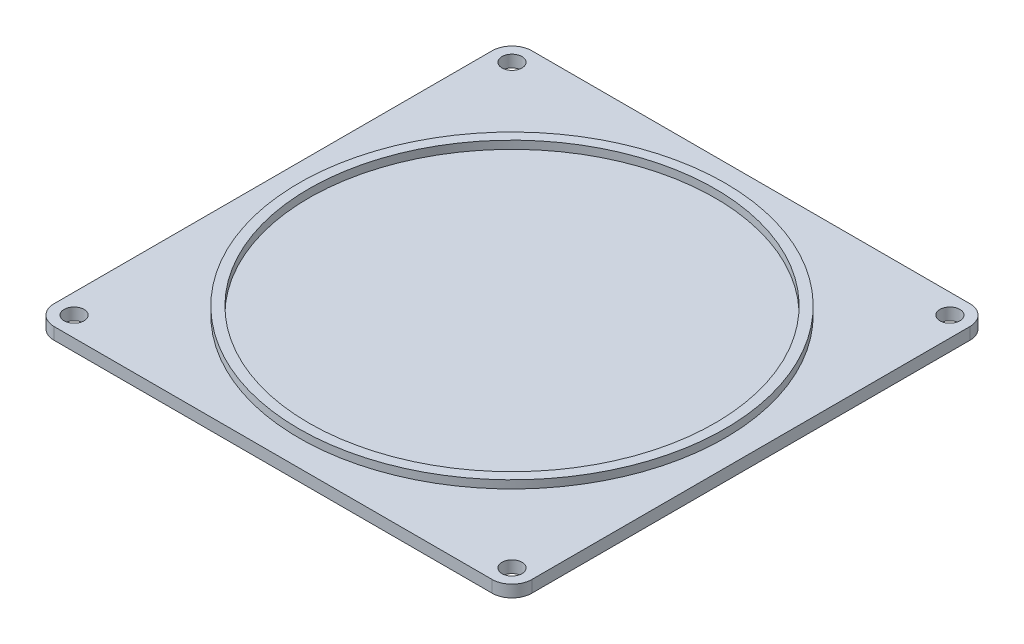
ISO-10303-21;
HEADER;
FILE_DESCRIPTION(('STEP AP214'),'2;1');
FILE_NAME('part.step','',(''),(''),'','','');
FILE_SCHEMA(('AUTOMOTIVE_DESIGN { 1 0 10303 214 1 1 1 1 }'));
ENDSEC;
DATA;
#1=APPLICATION_CONTEXT('core data for automotive mechanical design processes');
#2=APPLICATION_PROTOCOL_DEFINITION('international standard','automotive_design',2000,#1);
#3=PRODUCT_CONTEXT('',#1,'mechanical');
#4=PRODUCT('Part','Part','',(#3));
#5=PRODUCT_RELATED_PRODUCT_CATEGORY('part','',(#4));
#6=PRODUCT_DEFINITION_FORMATION('','',#4);
#7=PRODUCT_DEFINITION_CONTEXT('part definition',#1,'design');
#8=PRODUCT_DEFINITION('design','',#6,#7);
#9=PRODUCT_DEFINITION_SHAPE('','',#8);
#10=(LENGTH_UNIT() NAMED_UNIT(*) SI_UNIT(.MILLI.,.METRE.));
#11=(NAMED_UNIT(*) PLANE_ANGLE_UNIT() SI_UNIT($,.RADIAN.));
#12=(NAMED_UNIT(*) SI_UNIT($,.STERADIAN.) SOLID_ANGLE_UNIT());
#13=UNCERTAINTY_MEASURE_WITH_UNIT(LENGTH_MEASURE(1.E-05),#10,'distance_accuracy_value','');
#14=(GEOMETRIC_REPRESENTATION_CONTEXT(3) GLOBAL_UNCERTAINTY_ASSIGNED_CONTEXT((#13)) GLOBAL_UNIT_ASSIGNED_CONTEXT((#10,
#11,#12)) REPRESENTATION_CONTEXT('',''));
#15=CARTESIAN_POINT('',(0.,0.,0.));
#16=DIRECTION('',(0.,0.,1.));
#17=DIRECTION('',(1.,0.,0.));
#18=AXIS2_PLACEMENT_3D('',#15,#16,#17);
#19=CARTESIAN_POINT('',(60.,3.,60.));
#20=DIRECTION('',(-1.,0.,0.));
#21=DIRECTION('',(0.,0.,1.));
#22=AXIS2_PLACEMENT_3D('',#19,#20,#21);
#23=PLANE('',#22);
#24=DIRECTION('',(0.,0.,-1.));
#25=VECTOR('',#24,1.);
#26=CARTESIAN_POINT('',(60.,0.,60.));
#27=LINE('',#26,#25);
#28=CARTESIAN_POINT('',(60.,0.,55.));
#29=VERTEX_POINT('',#28);
#30=CARTESIAN_POINT('',(60.,0.,-55.));
#31=VERTEX_POINT('',#30);
#32=EDGE_CURVE('E130',#29,#31,#27,.T.);
#33=ORIENTED_EDGE('',*,*,#32,.T.);
#34=DIRECTION('',(0.,-1.,0.));
#35=VECTOR('',#34,1.);
#36=CARTESIAN_POINT('',(60.,3.,-55.));
#37=LINE('',#36,#35);
#38=CARTESIAN_POINT('',(60.,3.,-55.));
#39=VERTEX_POINT('',#38);
#40=EDGE_CURVE('E156',#31,#39,#37,.F.);
#41=ORIENTED_EDGE('',*,*,#40,.T.);
#42=DIRECTION('',(0.,0.,-1.));
#43=VECTOR('',#42,1.);
#44=CARTESIAN_POINT('',(60.,3.,60.));
#45=LINE('',#44,#43);
#46=CARTESIAN_POINT('',(60.,3.,55.));
#47=VERTEX_POINT('',#46);
#48=EDGE_CURVE('E128',#47,#39,#45,.T.);
#49=ORIENTED_EDGE('',*,*,#48,.F.);
#50=DIRECTION('',(0.,-1.,0.));
#51=VECTOR('',#50,1.);
#52=CARTESIAN_POINT('',(60.,3.,55.));
#53=LINE('',#52,#51);
#54=EDGE_CURVE('E153',#47,#29,#53,.T.);
#55=ORIENTED_EDGE('',*,*,#54,.T.);
#56=EDGE_LOOP('',(#33,#41,#49,#55));
#57=FACE_BOUND('',#56,.T.);
#58=ADVANCED_FACE('F35',(#57),#23,.F.);
#59=CARTESIAN_POINT('',(-60.,3.,-60.));
#60=DIRECTION('',(0.,0.,1.));
#61=DIRECTION('',(1.,0.,0.));
#62=AXIS2_PLACEMENT_3D('',#59,#60,#61);
#63=PLANE('',#62);
#64=DIRECTION('',(-1.,0.,0.));
#65=VECTOR('',#64,1.);
#66=CARTESIAN_POINT('',(-60.,0.,-60.));
#67=LINE('',#66,#65);
#68=CARTESIAN_POINT('',(55.,0.,-60.));
#69=VERTEX_POINT('',#68);
#70=CARTESIAN_POINT('',(-55.,0.,-60.));
#71=VERTEX_POINT('',#70);
#72=EDGE_CURVE('E126',#69,#71,#67,.T.);
#73=ORIENTED_EDGE('',*,*,#72,.T.);
#74=DIRECTION('',(0.,-1.,0.));
#75=VECTOR('',#74,1.);
#76=CARTESIAN_POINT('',(-55.,3.,-60.));
#77=LINE('',#76,#75);
#78=CARTESIAN_POINT('',(-55.,3.,-60.));
#79=VERTEX_POINT('',#78);
#80=EDGE_CURVE('E105',#71,#79,#77,.F.);
#81=ORIENTED_EDGE('',*,*,#80,.T.);
#82=DIRECTION('',(-1.,0.,0.));
#83=VECTOR('',#82,1.);
#84=CARTESIAN_POINT('',(-60.,3.,-60.));
#85=LINE('',#84,#83);
#86=CARTESIAN_POINT('',(55.,3.,-60.));
#87=VERTEX_POINT('',#86);
#88=EDGE_CURVE('E172',#87,#79,#85,.T.);
#89=ORIENTED_EDGE('',*,*,#88,.F.);
#90=DIRECTION('',(0.,-1.,0.));
#91=VECTOR('',#90,1.);
#92=CARTESIAN_POINT('',(55.,3.,-60.));
#93=LINE('',#92,#91);
#94=EDGE_CURVE('E110',#87,#69,#93,.T.);
#95=ORIENTED_EDGE('',*,*,#94,.T.);
#96=EDGE_LOOP('',(#73,#81,#89,#95));
#97=FACE_BOUND('',#96,.T.);
#98=ADVANCED_FACE('F239',(#97),#63,.F.);
#99=CARTESIAN_POINT('',(-60.,3.,60.));
#100=DIRECTION('',(1.,0.,0.));
#101=DIRECTION('',(0.,0.,-1.));
#102=AXIS2_PLACEMENT_3D('',#99,#100,#101);
#103=PLANE('',#102);
#104=DIRECTION('',(0.,0.,1.));
#105=VECTOR('',#104,1.);
#106=CARTESIAN_POINT('',(-60.,3.,60.));
#107=LINE('',#106,#105);
#108=CARTESIAN_POINT('',(-60.,3.,-55.));
#109=VERTEX_POINT('',#108);
#110=CARTESIAN_POINT('',(-60.,3.,55.));
#111=VERTEX_POINT('',#110);
#112=EDGE_CURVE('E119',#109,#111,#107,.T.);
#113=ORIENTED_EDGE('',*,*,#112,.F.);
#114=DIRECTION('',(0.,-1.,0.));
#115=VECTOR('',#114,1.);
#116=CARTESIAN_POINT('',(-60.,3.,-55.));
#117=LINE('',#116,#115);
#118=CARTESIAN_POINT('',(-60.,0.,-55.));
#119=VERTEX_POINT('',#118);
#120=EDGE_CURVE('E104',#109,#119,#117,.T.);
#121=ORIENTED_EDGE('',*,*,#120,.T.);
#122=DIRECTION('',(0.,0.,1.));
#123=VECTOR('',#122,1.);
#124=CARTESIAN_POINT('',(-60.,0.,60.));
#125=LINE('',#124,#123);
#126=CARTESIAN_POINT('',(-60.,0.,55.));
#127=VERTEX_POINT('',#126);
#128=EDGE_CURVE('E117',#119,#127,#125,.T.);
#129=ORIENTED_EDGE('',*,*,#128,.T.);
#130=DIRECTION('',(0.,-1.,0.));
#131=VECTOR('',#130,1.);
#132=CARTESIAN_POINT('',(-60.,3.,55.));
#133=LINE('',#132,#131);
#134=EDGE_CURVE('E121',#127,#111,#133,.F.);
#135=ORIENTED_EDGE('',*,*,#134,.T.);
#136=EDGE_LOOP('',(#113,#121,#129,#135));
#137=FACE_BOUND('',#136,.T.);
#138=ADVANCED_FACE('F116',(#137),#103,.F.);
#139=CARTESIAN_POINT('',(-60.,3.,60.));
#140=DIRECTION('',(0.,0.,-1.));
#141=DIRECTION('',(-1.,0.,0.));
#142=AXIS2_PLACEMENT_3D('',#139,#140,#141);
#143=PLANE('',#142);
#144=DIRECTION('',(1.,0.,0.));
#145=VECTOR('',#144,1.);
#146=CARTESIAN_POINT('',(-60.,0.,60.));
#147=LINE('',#146,#145);
#148=CARTESIAN_POINT('',(-55.,0.,60.));
#149=VERTEX_POINT('',#148);
#150=CARTESIAN_POINT('',(55.,0.,60.));
#151=VERTEX_POINT('',#150);
#152=EDGE_CURVE('E125',#149,#151,#147,.T.);
#153=ORIENTED_EDGE('',*,*,#152,.T.);
#154=DIRECTION('',(0.,-1.,0.));
#155=VECTOR('',#154,1.);
#156=CARTESIAN_POINT('',(55.,3.,60.));
#157=LINE('',#156,#155);
#158=CARTESIAN_POINT('',(55.,3.,60.));
#159=VERTEX_POINT('',#158);
#160=EDGE_CURVE('E11',#151,#159,#157,.F.);
#161=ORIENTED_EDGE('',*,*,#160,.T.);
#162=DIRECTION('',(1.,0.,0.));
#163=VECTOR('',#162,1.);
#164=CARTESIAN_POINT('',(-60.,3.,60.));
#165=LINE('',#164,#163);
#166=CARTESIAN_POINT('',(-55.,3.,60.));
#167=VERTEX_POINT('',#166);
#168=EDGE_CURVE('E137',#167,#159,#165,.T.);
#169=ORIENTED_EDGE('',*,*,#168,.F.);
#170=DIRECTION('',(0.,-1.,0.));
#171=VECTOR('',#170,1.);
#172=CARTESIAN_POINT('',(-55.,3.,60.));
#173=LINE('',#172,#171);
#174=EDGE_CURVE('E43',#167,#149,#173,.T.);
#175=ORIENTED_EDGE('',*,*,#174,.T.);
#176=EDGE_LOOP('',(#153,#161,#169,#175));
#177=FACE_BOUND('',#176,.T.);
#178=ADVANCED_FACE('F159',(#177),#143,.F.);
#179=CARTESIAN_POINT('',(0.,3.,0.));
#180=DIRECTION('',(0.,-1.,0.));
#181=DIRECTION('',(0.,0.,-1.));
#182=AXIS2_PLACEMENT_3D('',#179,#180,#181);
#183=PLANE('',#182);
#184=CARTESIAN_POINT('',(55.,3.,-55.));
#185=DIRECTION('',(0.,1.,0.));
#186=DIRECTION('',(0.,0.,-1.));
#187=AXIS2_PLACEMENT_3D('',#184,#185,#186);
#188=CIRCLE('',#187,2.5);
#189=CARTESIAN_POINT('',(55.,3.,-57.5));
#190=VERTEX_POINT('',#189);
#191=EDGE_CURVE('E206',#190,#190,#188,.T.);
#192=ORIENTED_EDGE('',*,*,#191,.F.);
#193=EDGE_LOOP('',(#192));
#194=FACE_BOUND('',#193,.T.);
#195=CARTESIAN_POINT('',(-55.,3.,55.));
#196=DIRECTION('',(0.,1.,0.));
#197=DIRECTION('',(0.,0.,-1.));
#198=AXIS2_PLACEMENT_3D('',#195,#196,#197);
#199=CIRCLE('',#198,2.5);
#200=CARTESIAN_POINT('',(-55.,3.,52.5));
#201=VERTEX_POINT('',#200);
#202=EDGE_CURVE('E199',#201,#201,#199,.T.);
#203=ORIENTED_EDGE('',*,*,#202,.F.);
#204=EDGE_LOOP('',(#203));
#205=FACE_BOUND('',#204,.T.);
#206=CARTESIAN_POINT('',(55.,3.,55.));
#207=DIRECTION('',(0.,1.,0.));
#208=DIRECTION('',(0.,0.,1.));
#209=AXIS2_PLACEMENT_3D('',#206,#207,#208);
#210=CIRCLE('',#209,2.5);
#211=CARTESIAN_POINT('',(55.,3.,57.5));
#212=VERTEX_POINT('',#211);
#213=EDGE_CURVE('E211',#212,#212,#210,.T.);
#214=ORIENTED_EDGE('',*,*,#213,.F.);
#215=EDGE_LOOP('',(#214));
#216=FACE_BOUND('',#215,.T.);
#217=CARTESIAN_POINT('',(-55.,3.,-55.));
#218=DIRECTION('',(0.,1.,0.));
#219=DIRECTION('',(0.,0.,1.));
#220=AXIS2_PLACEMENT_3D('',#217,#218,#219);
#221=CIRCLE('',#220,2.5);
#222=CARTESIAN_POINT('',(-55.,3.,-52.5));
#223=VERTEX_POINT('',#222);
#224=EDGE_CURVE('E193',#223,#223,#221,.T.);
#225=ORIENTED_EDGE('',*,*,#224,.F.);
#226=EDGE_LOOP('',(#225));
#227=FACE_BOUND('',#226,.T.);
#228=CARTESIAN_POINT('',(0.,3.,0.));
#229=DIRECTION('',(0.,-1.,0.));
#230=DIRECTION('',(0.,0.,-1.));
#231=AXIS2_PLACEMENT_3D('',#228,#229,#230);
#232=CIRCLE('',#231,53.5);
#233=CARTESIAN_POINT('',(0.,3.,-53.5));
#234=VERTEX_POINT('',#233);
#235=EDGE_CURVE('E134',#234,#234,#232,.F.);
#236=ORIENTED_EDGE('',*,*,#235,.F.);
#237=EDGE_LOOP('',(#236));
#238=FACE_BOUND('',#237,.T.);
#239=ORIENTED_EDGE('',*,*,#88,.T.);
#240=CARTESIAN_POINT('',(-55.,3.,-55.));
#241=DIRECTION('',(0.,-1.,0.));
#242=DIRECTION('',(0.,0.,-1.));
#243=AXIS2_PLACEMENT_3D('',#240,#241,#242);
#244=CIRCLE('',#243,5.);
#245=EDGE_CURVE('E151',#79,#109,#244,.F.);
#246=ORIENTED_EDGE('',*,*,#245,.T.);
#247=ORIENTED_EDGE('',*,*,#112,.T.);
#248=CARTESIAN_POINT('',(-55.,3.,55.));
#249=DIRECTION('',(0.,-1.,0.));
#250=DIRECTION('',(0.,0.,-1.));
#251=AXIS2_PLACEMENT_3D('',#248,#249,#250);
#252=CIRCLE('',#251,5.);
#253=EDGE_CURVE('E55',#111,#167,#252,.F.);
#254=ORIENTED_EDGE('',*,*,#253,.T.);
#255=ORIENTED_EDGE('',*,*,#168,.T.);
#256=CARTESIAN_POINT('',(55.,3.,55.));
#257=DIRECTION('',(0.,-1.,0.));
#258=DIRECTION('',(0.,0.,-1.));
#259=AXIS2_PLACEMENT_3D('',#256,#257,#258);
#260=CIRCLE('',#259,5.);
#261=EDGE_CURVE('E147',#159,#47,#260,.F.);
#262=ORIENTED_EDGE('',*,*,#261,.T.);
#263=ORIENTED_EDGE('',*,*,#48,.T.);
#264=CARTESIAN_POINT('',(55.,3.,-55.));
#265=DIRECTION('',(0.,-1.,0.));
#266=DIRECTION('',(0.,0.,-1.));
#267=AXIS2_PLACEMENT_3D('',#264,#265,#266);
#268=CIRCLE('',#267,5.);
#269=EDGE_CURVE('E149',#39,#87,#268,.F.);
#270=ORIENTED_EDGE('',*,*,#269,.T.);
#271=EDGE_LOOP('',(#239,#246,#247,#254,#255,#262,#263,#270));
#272=FACE_BOUND('',#271,.T.);
#273=ADVANCED_FACE('F227',(#194,#205,#216,#227,#238,#272),#183,.F.);
#274=CARTESIAN_POINT('',(0.,0.,0.));
#275=DIRECTION('',(0.,-1.,0.));
#276=DIRECTION('',(0.,0.,-1.));
#277=AXIS2_PLACEMENT_3D('',#274,#275,#276);
#278=PLANE('',#277);
#279=CARTESIAN_POINT('',(55.,0.,-55.));
#280=DIRECTION('',(0.,1.,0.));
#281=DIRECTION('',(0.,0.,-1.));
#282=AXIS2_PLACEMENT_3D('',#279,#280,#281);
#283=CIRCLE('',#282,2.5);
#284=CARTESIAN_POINT('',(55.,0.,-57.5));
#285=VERTEX_POINT('',#284);
#286=EDGE_CURVE('E196',#285,#285,#283,.T.);
#287=ORIENTED_EDGE('',*,*,#286,.T.);
#288=EDGE_LOOP('',(#287));
#289=FACE_BOUND('',#288,.T.);
#290=CARTESIAN_POINT('',(-55.,0.,55.));
#291=DIRECTION('',(0.,1.,0.));
#292=DIRECTION('',(0.,0.,-1.));
#293=AXIS2_PLACEMENT_3D('',#290,#291,#292);
#294=CIRCLE('',#293,2.5);
#295=CARTESIAN_POINT('',(-55.,0.,52.5));
#296=VERTEX_POINT('',#295);
#297=EDGE_CURVE('E202',#296,#296,#294,.T.);
#298=ORIENTED_EDGE('',*,*,#297,.T.);
#299=EDGE_LOOP('',(#298));
#300=FACE_BOUND('',#299,.T.);
#301=CARTESIAN_POINT('',(55.,0.,55.));
#302=DIRECTION('',(0.,1.,0.));
#303=DIRECTION('',(0.,0.,1.));
#304=AXIS2_PLACEMENT_3D('',#301,#302,#303);
#305=CIRCLE('',#304,2.5);
#306=CARTESIAN_POINT('',(55.,0.,57.5));
#307=VERTEX_POINT('',#306);
#308=EDGE_CURVE('E203',#307,#307,#305,.T.);
#309=ORIENTED_EDGE('',*,*,#308,.T.);
#310=EDGE_LOOP('',(#309));
#311=FACE_BOUND('',#310,.T.);
#312=CARTESIAN_POINT('',(-55.,0.,-55.));
#313=DIRECTION('',(0.,1.,0.));
#314=DIRECTION('',(0.,0.,1.));
#315=AXIS2_PLACEMENT_3D('',#312,#313,#314);
#316=CIRCLE('',#315,2.5);
#317=CARTESIAN_POINT('',(-55.,0.,-52.5));
#318=VERTEX_POINT('',#317);
#319=EDGE_CURVE('E191',#318,#318,#316,.T.);
#320=ORIENTED_EDGE('',*,*,#319,.T.);
#321=EDGE_LOOP('',(#320));
#322=FACE_BOUND('',#321,.T.);
#323=ORIENTED_EDGE('',*,*,#128,.F.);
#324=CARTESIAN_POINT('',(-55.,0.,-55.));
#325=DIRECTION('',(0.,-1.,0.));
#326=DIRECTION('',(0.,0.,-1.));
#327=AXIS2_PLACEMENT_3D('',#324,#325,#326);
#328=CIRCLE('',#327,5.);
#329=EDGE_CURVE('E100',#119,#71,#328,.T.);
#330=ORIENTED_EDGE('',*,*,#329,.T.);
#331=ORIENTED_EDGE('',*,*,#72,.F.);
#332=CARTESIAN_POINT('',(55.,0.,-55.));
#333=DIRECTION('',(0.,-1.,0.));
#334=DIRECTION('',(0.,0.,-1.));
#335=AXIS2_PLACEMENT_3D('',#332,#333,#334);
#336=CIRCLE('',#335,5.);
#337=EDGE_CURVE('E111',#69,#31,#336,.T.);
#338=ORIENTED_EDGE('',*,*,#337,.T.);
#339=ORIENTED_EDGE('',*,*,#32,.F.);
#340=CARTESIAN_POINT('',(55.,0.,55.));
#341=DIRECTION('',(0.,-1.,0.));
#342=DIRECTION('',(0.,0.,-1.));
#343=AXIS2_PLACEMENT_3D('',#340,#341,#342);
#344=CIRCLE('',#343,5.);
#345=EDGE_CURVE('E140',#29,#151,#344,.T.);
#346=ORIENTED_EDGE('',*,*,#345,.T.);
#347=ORIENTED_EDGE('',*,*,#152,.F.);
#348=CARTESIAN_POINT('',(-55.,0.,55.));
#349=DIRECTION('',(0.,-1.,0.));
#350=DIRECTION('',(0.,0.,-1.));
#351=AXIS2_PLACEMENT_3D('',#348,#349,#350);
#352=CIRCLE('',#351,5.);
#353=EDGE_CURVE('E120',#149,#127,#352,.T.);
#354=ORIENTED_EDGE('',*,*,#353,.T.);
#355=EDGE_LOOP('',(#323,#330,#331,#338,#339,#346,#347,#354));
#356=FACE_BOUND('',#355,.T.);
#357=ADVANCED_FACE('F123',(#289,#300,#311,#322,#356),#278,.T.);
#358=CARTESIAN_POINT('',(0.,5.,0.));
#359=DIRECTION('',(0.,1.,0.));
#360=DIRECTION('',(0.,0.,1.));
#361=AXIS2_PLACEMENT_3D('',#358,#359,#360);
#362=PLANE('',#361);
#363=CARTESIAN_POINT('',(0.,5.,0.));
#364=DIRECTION('',(0.,1.,0.));
#365=DIRECTION('',(0.,0.,1.));
#366=AXIS2_PLACEMENT_3D('',#363,#364,#365);
#367=CIRCLE('',#366,53.5);
#368=CARTESIAN_POINT('',(0.,5.,53.5));
#369=VERTEX_POINT('',#368);
#370=EDGE_CURVE('E177',#369,#369,#367,.T.);
#371=ORIENTED_EDGE('',*,*,#370,.T.);
#372=EDGE_LOOP('',(#371));
#373=FACE_BOUND('',#372,.T.);
#374=CARTESIAN_POINT('',(0.,5.,0.));
#375=DIRECTION('',(0.,1.,0.));
#376=DIRECTION('',(0.,0.,1.));
#377=AXIS2_PLACEMENT_3D('',#374,#375,#376);
#378=CIRCLE('',#377,51.);
#379=CARTESIAN_POINT('',(0.,5.,51.));
#380=VERTEX_POINT('',#379);
#381=EDGE_CURVE('E182',#380,#380,#378,.T.);
#382=ORIENTED_EDGE('',*,*,#381,.F.);
#383=EDGE_LOOP('',(#382));
#384=FACE_BOUND('',#383,.T.);
#385=ADVANCED_FACE('F262',(#373,#384),#362,.T.);
#386=CARTESIAN_POINT('',(0.,5.,0.));
#387=DIRECTION('',(0.,-1.,0.));
#388=DIRECTION('',(0.,0.,-1.));
#389=AXIS2_PLACEMENT_3D('',#386,#387,#388);
#390=CYLINDRICAL_SURFACE('',#389,53.5);
#391=ORIENTED_EDGE('',*,*,#370,.F.);
#392=EDGE_LOOP('',(#391));
#393=FACE_BOUND('',#392,.T.);
#394=ORIENTED_EDGE('',*,*,#235,.T.);
#395=EDGE_LOOP('',(#394));
#396=FACE_BOUND('',#395,.T.);
#397=ADVANCED_FACE('F265',(#393,#396),#390,.T.);
#398=CARTESIAN_POINT('',(0.,5.,0.));
#399=DIRECTION('',(0.,-1.,0.));
#400=DIRECTION('',(0.,0.,-1.));
#401=AXIS2_PLACEMENT_3D('',#398,#399,#400);
#402=CYLINDRICAL_SURFACE('',#401,51.);
#403=ORIENTED_EDGE('',*,*,#381,.T.);
#404=EDGE_LOOP('',(#403));
#405=FACE_BOUND('',#404,.T.);
#406=CARTESIAN_POINT('',(0.,3.,0.));
#407=DIRECTION('',(0.,1.,0.));
#408=DIRECTION('',(0.,0.,1.));
#409=AXIS2_PLACEMENT_3D('',#406,#407,#408);
#410=CIRCLE('',#409,51.);
#411=CARTESIAN_POINT('',(0.,3.,51.));
#412=VERTEX_POINT('',#411);
#413=EDGE_CURVE('E186',#412,#412,#410,.T.);
#414=ORIENTED_EDGE('',*,*,#413,.F.);
#415=EDGE_LOOP('',(#414));
#416=FACE_BOUND('',#415,.T.);
#417=ADVANCED_FACE('F268',(#405,#416),#402,.F.);
#418=ORIENTED_EDGE('',*,*,#413,.T.);
#419=EDGE_LOOP('',(#418));
#420=FACE_BOUND('',#419,.T.);
#421=ADVANCED_FACE('F232',(#420),#183,.F.);
#422=CARTESIAN_POINT('',(-55.,0.,-55.));
#423=DIRECTION('',(0.,1.,0.));
#424=DIRECTION('',(0.,0.,1.));
#425=AXIS2_PLACEMENT_3D('',#422,#423,#424);
#426=CYLINDRICAL_SURFACE('',#425,2.5);
#427=ORIENTED_EDGE('',*,*,#319,.F.);
#428=EDGE_LOOP('',(#427));
#429=FACE_BOUND('',#428,.T.);
#430=ORIENTED_EDGE('',*,*,#224,.T.);
#431=EDGE_LOOP('',(#430));
#432=FACE_BOUND('',#431,.T.);
#433=ADVANCED_FACE('F223',(#429,#432),#426,.F.);
#434=CARTESIAN_POINT('',(55.,0.,55.));
#435=DIRECTION('',(0.,1.,0.));
#436=DIRECTION('',(0.,0.,1.));
#437=AXIS2_PLACEMENT_3D('',#434,#435,#436);
#438=CYLINDRICAL_SURFACE('',#437,2.5);
#439=ORIENTED_EDGE('',*,*,#308,.F.);
#440=EDGE_LOOP('',(#439));
#441=FACE_BOUND('',#440,.T.);
#442=ORIENTED_EDGE('',*,*,#213,.T.);
#443=EDGE_LOOP('',(#442));
#444=FACE_BOUND('',#443,.T.);
#445=ADVANCED_FACE('F219',(#441,#444),#438,.F.);
#446=CARTESIAN_POINT('',(-55.,0.,55.));
#447=DIRECTION('',(0.,1.,0.));
#448=DIRECTION('',(0.,0.,1.));
#449=AXIS2_PLACEMENT_3D('',#446,#447,#448);
#450=CYLINDRICAL_SURFACE('',#449,2.5);
#451=ORIENTED_EDGE('',*,*,#297,.F.);
#452=EDGE_LOOP('',(#451));
#453=FACE_BOUND('',#452,.T.);
#454=ORIENTED_EDGE('',*,*,#202,.T.);
#455=EDGE_LOOP('',(#454));
#456=FACE_BOUND('',#455,.T.);
#457=ADVANCED_FACE('F222',(#453,#456),#450,.F.);
#458=CARTESIAN_POINT('',(55.,0.,-55.));
#459=DIRECTION('',(0.,1.,0.));
#460=DIRECTION('',(0.,0.,1.));
#461=AXIS2_PLACEMENT_3D('',#458,#459,#460);
#462=CYLINDRICAL_SURFACE('',#461,2.5);
#463=ORIENTED_EDGE('',*,*,#286,.F.);
#464=EDGE_LOOP('',(#463));
#465=FACE_BOUND('',#464,.T.);
#466=ORIENTED_EDGE('',*,*,#191,.T.);
#467=EDGE_LOOP('',(#466));
#468=FACE_BOUND('',#467,.T.);
#469=ADVANCED_FACE('F248',(#465,#468),#462,.F.);
#470=CARTESIAN_POINT('',(-55.,3.,-55.));
#471=DIRECTION('',(0.,-1.,0.));
#472=DIRECTION('',(0.,0.,-1.));
#473=AXIS2_PLACEMENT_3D('',#470,#471,#472);
#474=CYLINDRICAL_SURFACE('',#473,5.);
#475=ORIENTED_EDGE('',*,*,#245,.F.);
#476=ORIENTED_EDGE('',*,*,#80,.F.);
#477=ORIENTED_EDGE('',*,*,#329,.F.);
#478=ORIENTED_EDGE('',*,*,#120,.F.);
#479=EDGE_LOOP('',(#475,#476,#477,#478));
#480=FACE_BOUND('',#479,.T.);
#481=ADVANCED_FACE('F103',(#480),#474,.T.);
#482=CARTESIAN_POINT('',(55.,3.,-55.));
#483=DIRECTION('',(0.,-1.,0.));
#484=DIRECTION('',(0.,0.,-1.));
#485=AXIS2_PLACEMENT_3D('',#482,#483,#484);
#486=CYLINDRICAL_SURFACE('',#485,5.);
#487=ORIENTED_EDGE('',*,*,#269,.F.);
#488=ORIENTED_EDGE('',*,*,#40,.F.);
#489=ORIENTED_EDGE('',*,*,#337,.F.);
#490=ORIENTED_EDGE('',*,*,#94,.F.);
#491=EDGE_LOOP('',(#487,#488,#489,#490));
#492=FACE_BOUND('',#491,.T.);
#493=ADVANCED_FACE('F241',(#492),#486,.T.);
#494=CARTESIAN_POINT('',(55.,3.,55.));
#495=DIRECTION('',(0.,-1.,0.));
#496=DIRECTION('',(0.,0.,-1.));
#497=AXIS2_PLACEMENT_3D('',#494,#495,#496);
#498=CYLINDRICAL_SURFACE('',#497,5.);
#499=ORIENTED_EDGE('',*,*,#261,.F.);
#500=ORIENTED_EDGE('',*,*,#160,.F.);
#501=ORIENTED_EDGE('',*,*,#345,.F.);
#502=ORIENTED_EDGE('',*,*,#54,.F.);
#503=EDGE_LOOP('',(#499,#500,#501,#502));
#504=FACE_BOUND('',#503,.T.);
#505=ADVANCED_FACE('F166',(#504),#498,.T.);
#506=CARTESIAN_POINT('',(-55.,3.,55.));
#507=DIRECTION('',(0.,-1.,0.));
#508=DIRECTION('',(0.,0.,-1.));
#509=AXIS2_PLACEMENT_3D('',#506,#507,#508);
#510=CYLINDRICAL_SURFACE('',#509,5.);
#511=ORIENTED_EDGE('',*,*,#253,.F.);
#512=ORIENTED_EDGE('',*,*,#134,.F.);
#513=ORIENTED_EDGE('',*,*,#353,.F.);
#514=ORIENTED_EDGE('',*,*,#174,.F.);
#515=EDGE_LOOP('',(#511,#512,#513,#514));
#516=FACE_BOUND('',#515,.T.);
#517=ADVANCED_FACE('F37',(#516),#510,.T.);
#518=CLOSED_SHELL('',(#58,#98,#138,#178,#273,#357,#385,#397,#417,#421,#433,#445,#457,#469,#481,
#493,#505,#517));
#519=MANIFOLD_SOLID_BREP('B2',#518);
#520=ADVANCED_BREP_SHAPE_REPRESENTATION('',(#18,#519),#14);
#521=SHAPE_DEFINITION_REPRESENTATION(#9,#520);
ENDSEC;
END-ISO-10303-21;
